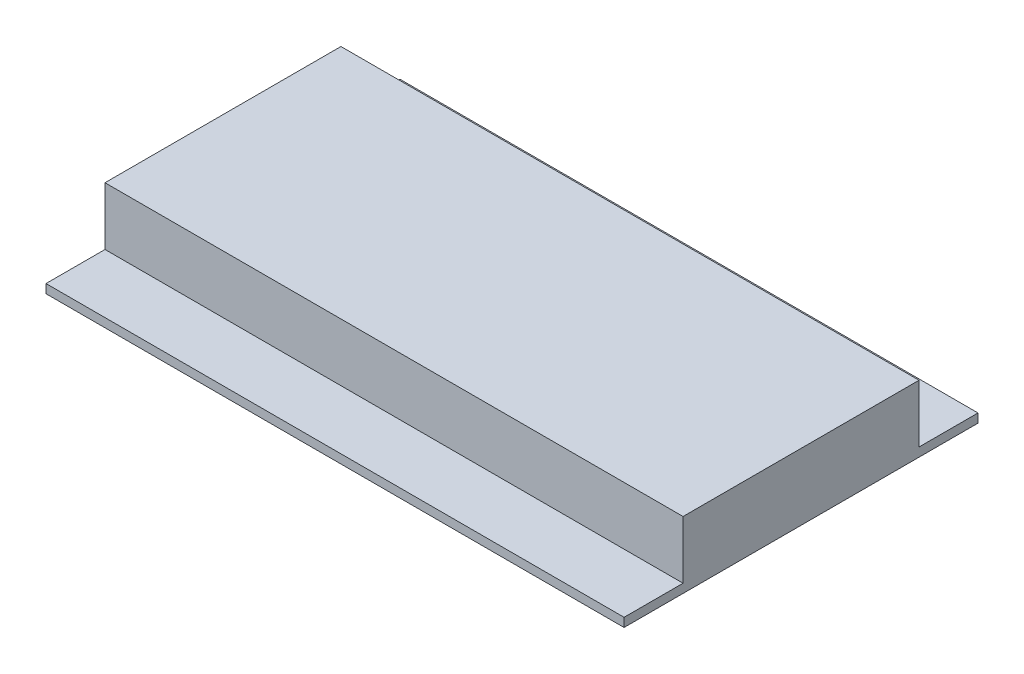
ISO-10303-21;
HEADER;
FILE_DESCRIPTION(('STEP AP214'),'2;1');
FILE_NAME('part.step','',(''),(''),'','','');
FILE_SCHEMA(('AUTOMOTIVE_DESIGN { 1 0 10303 214 1 1 1 1 }'));
ENDSEC;
DATA;
#1=APPLICATION_CONTEXT('core data for automotive mechanical design processes');
#2=APPLICATION_PROTOCOL_DEFINITION('international standard','automotive_design',2000,#1);
#3=PRODUCT_CONTEXT('',#1,'mechanical');
#4=PRODUCT('Part','Part','',(#3));
#5=PRODUCT_RELATED_PRODUCT_CATEGORY('part','',(#4));
#6=PRODUCT_DEFINITION_FORMATION('','',#4);
#7=PRODUCT_DEFINITION_CONTEXT('part definition',#1,'design');
#8=PRODUCT_DEFINITION('design','',#6,#7);
#9=PRODUCT_DEFINITION_SHAPE('','',#8);
#10=(LENGTH_UNIT() NAMED_UNIT(*) SI_UNIT(.MILLI.,.METRE.));
#11=(NAMED_UNIT(*) PLANE_ANGLE_UNIT() SI_UNIT($,.RADIAN.));
#12=(NAMED_UNIT(*) SI_UNIT($,.STERADIAN.) SOLID_ANGLE_UNIT());
#13=UNCERTAINTY_MEASURE_WITH_UNIT(LENGTH_MEASURE(1.E-05),#10,'distance_accuracy_value','');
#14=(GEOMETRIC_REPRESENTATION_CONTEXT(3) GLOBAL_UNCERTAINTY_ASSIGNED_CONTEXT((#13)) GLOBAL_UNIT_ASSIGNED_CONTEXT((#10,
#11,#12)) REPRESENTATION_CONTEXT('',''));
#15=CARTESIAN_POINT('',(0.,0.,0.));
#16=DIRECTION('',(0.,0.,1.));
#17=DIRECTION('',(1.,0.,0.));
#18=AXIS2_PLACEMENT_3D('',#15,#16,#17);
#19=CARTESIAN_POINT('',(0.,1.5,0.));
#20=DIRECTION('',(0.,1.,0.));
#21=DIRECTION('',(0.,0.,1.));
#22=AXIS2_PLACEMENT_3D('',#19,#20,#21);
#23=PLANE('',#22);
#24=DIRECTION('',(-1.,0.,0.));
#25=VECTOR('',#24,1.);
#26=CARTESIAN_POINT('',(-49.,1.5,-20.));
#27=LINE('',#26,#25);
#28=CARTESIAN_POINT('',(49.,1.5,-20.));
#29=VERTEX_POINT('',#28);
#30=CARTESIAN_POINT('',(-49.,1.5,-20.));
#31=VERTEX_POINT('',#30);
#32=EDGE_CURVE('E65',#29,#31,#27,.T.);
#33=ORIENTED_EDGE('',*,*,#32,.F.);
#34=DIRECTION('',(0.,0.,-1.));
#35=VECTOR('',#34,1.);
#36=CARTESIAN_POINT('',(49.,1.5,-30.));
#37=LINE('',#36,#35);
#38=CARTESIAN_POINT('',(49.,1.5,-30.));
#39=VERTEX_POINT('',#38);
#40=EDGE_CURVE('E157',#29,#39,#37,.T.);
#41=ORIENTED_EDGE('',*,*,#40,.T.);
#42=DIRECTION('',(-1.,0.,0.));
#43=VECTOR('',#42,1.);
#44=CARTESIAN_POINT('',(-49.,1.5,-30.));
#45=LINE('',#44,#43);
#46=CARTESIAN_POINT('',(-49.,1.5,-30.));
#47=VERTEX_POINT('',#46);
#48=EDGE_CURVE('E161',#39,#47,#45,.T.);
#49=ORIENTED_EDGE('',*,*,#48,.T.);
#50=DIRECTION('',(0.,0.,1.));
#51=VECTOR('',#50,1.);
#52=CARTESIAN_POINT('',(-49.,1.5,-30.));
#53=LINE('',#52,#51);
#54=EDGE_CURVE('E151',#47,#31,#53,.T.);
#55=ORIENTED_EDGE('',*,*,#54,.T.);
#56=EDGE_LOOP('',(#33,#41,#49,#55));
#57=FACE_BOUND('',#56,.T.);
#58=ADVANCED_FACE('F49',(#57),#23,.T.);
#59=CARTESIAN_POINT('',(-49.,1.5,-30.));
#60=DIRECTION('',(1.,0.,0.));
#61=DIRECTION('',(0.,0.,-1.));
#62=AXIS2_PLACEMENT_3D('',#59,#60,#61);
#63=PLANE('',#62);
#64=DIRECTION('',(0.,0.,1.));
#65=VECTOR('',#64,1.);
#66=CARTESIAN_POINT('',(-49.,0.,-30.));
#67=LINE('',#66,#65);
#68=CARTESIAN_POINT('',(-49.,0.,-30.));
#69=VERTEX_POINT('',#68);
#70=CARTESIAN_POINT('',(-49.,0.,30.));
#71=VERTEX_POINT('',#70);
#72=EDGE_CURVE('E141',#69,#71,#67,.T.);
#73=ORIENTED_EDGE('',*,*,#72,.T.);
#74=DIRECTION('',(0.,-1.,0.));
#75=VECTOR('',#74,1.);
#76=CARTESIAN_POINT('',(-49.,1.5,30.));
#77=LINE('',#76,#75);
#78=CARTESIAN_POINT('',(-49.,1.5,30.));
#79=VERTEX_POINT('',#78);
#80=EDGE_CURVE('E11',#79,#71,#77,.T.);
#81=ORIENTED_EDGE('',*,*,#80,.F.);
#82=CARTESIAN_POINT('',(-49.,1.5,20.));
#83=VERTEX_POINT('',#82);
#84=EDGE_CURVE('E139',#83,#79,#53,.T.);
#85=ORIENTED_EDGE('',*,*,#84,.F.);
#86=DIRECTION('',(0.,-1.,0.));
#87=VECTOR('',#86,1.);
#88=CARTESIAN_POINT('',(-49.,11.3,20.));
#89=LINE('',#88,#87);
#90=CARTESIAN_POINT('',(-49.,11.3,20.));
#91=VERTEX_POINT('',#90);
#92=EDGE_CURVE('E119',#91,#83,#89,.T.);
#93=ORIENTED_EDGE('',*,*,#92,.F.);
#94=DIRECTION('',(0.,0.,1.));
#95=VECTOR('',#94,1.);
#96=CARTESIAN_POINT('',(-49.,11.3,-20.));
#97=LINE('',#96,#95);
#98=CARTESIAN_POINT('',(-49.,11.3,-20.));
#99=VERTEX_POINT('',#98);
#100=EDGE_CURVE('E126',#99,#91,#97,.T.);
#101=ORIENTED_EDGE('',*,*,#100,.F.);
#102=DIRECTION('',(0.,-1.,0.));
#103=VECTOR('',#102,1.);
#104=CARTESIAN_POINT('',(-49.,11.3,-20.));
#105=LINE('',#104,#103);
#106=EDGE_CURVE('E198',#99,#31,#105,.T.);
#107=ORIENTED_EDGE('',*,*,#106,.T.);
#108=ORIENTED_EDGE('',*,*,#54,.F.);
#109=DIRECTION('',(0.,-1.,0.));
#110=VECTOR('',#109,1.);
#111=CARTESIAN_POINT('',(-49.,1.5,-30.));
#112=LINE('',#111,#110);
#113=EDGE_CURVE('E163',#47,#69,#112,.T.);
#114=ORIENTED_EDGE('',*,*,#113,.T.);
#115=EDGE_LOOP('',(#73,#81,#85,#93,#101,#107,#108,#114));
#116=FACE_BOUND('',#115,.T.);
#117=ADVANCED_FACE('F51',(#116),#63,.F.);
#118=CARTESIAN_POINT('',(-49.,1.5,30.));
#119=DIRECTION('',(0.,0.,-1.));
#120=DIRECTION('',(-1.,0.,0.));
#121=AXIS2_PLACEMENT_3D('',#118,#119,#120);
#122=PLANE('',#121);
#123=DIRECTION('',(1.,0.,0.));
#124=VECTOR('',#123,1.);
#125=CARTESIAN_POINT('',(-49.,0.,30.));
#126=LINE('',#125,#124);
#127=CARTESIAN_POINT('',(49.,0.,30.));
#128=VERTEX_POINT('',#127);
#129=EDGE_CURVE('E145',#71,#128,#126,.T.);
#130=ORIENTED_EDGE('',*,*,#129,.T.);
#131=DIRECTION('',(0.,-1.,0.));
#132=VECTOR('',#131,1.);
#133=CARTESIAN_POINT('',(49.,1.5,30.));
#134=LINE('',#133,#132);
#135=CARTESIAN_POINT('',(49.,1.5,30.));
#136=VERTEX_POINT('',#135);
#137=EDGE_CURVE('E58',#136,#128,#134,.T.);
#138=ORIENTED_EDGE('',*,*,#137,.F.);
#139=DIRECTION('',(1.,0.,0.));
#140=VECTOR('',#139,1.);
#141=CARTESIAN_POINT('',(-49.,1.5,30.));
#142=LINE('',#141,#140);
#143=EDGE_CURVE('E154',#79,#136,#142,.T.);
#144=ORIENTED_EDGE('',*,*,#143,.F.);
#145=ORIENTED_EDGE('',*,*,#80,.T.);
#146=EDGE_LOOP('',(#130,#138,#144,#145));
#147=FACE_BOUND('',#146,.T.);
#148=ADVANCED_FACE('F217',(#147),#122,.F.);
#149=CARTESIAN_POINT('',(49.,1.5,-30.));
#150=DIRECTION('',(-1.,0.,0.));
#151=DIRECTION('',(0.,0.,1.));
#152=AXIS2_PLACEMENT_3D('',#149,#150,#151);
#153=PLANE('',#152);
#154=DIRECTION('',(0.,0.,-1.));
#155=VECTOR('',#154,1.);
#156=CARTESIAN_POINT('',(49.,0.,-30.));
#157=LINE('',#156,#155);
#158=CARTESIAN_POINT('',(49.,0.,-30.));
#159=VERTEX_POINT('',#158);
#160=EDGE_CURVE('E167',#128,#159,#157,.T.);
#161=ORIENTED_EDGE('',*,*,#160,.T.);
#162=DIRECTION('',(0.,-1.,0.));
#163=VECTOR('',#162,1.);
#164=CARTESIAN_POINT('',(49.,1.5,-30.));
#165=LINE('',#164,#163);
#166=EDGE_CURVE('E176',#39,#159,#165,.T.);
#167=ORIENTED_EDGE('',*,*,#166,.F.);
#168=ORIENTED_EDGE('',*,*,#40,.F.);
#169=DIRECTION('',(0.,-1.,0.));
#170=VECTOR('',#169,1.);
#171=CARTESIAN_POINT('',(49.,11.3,-20.));
#172=LINE('',#171,#170);
#173=CARTESIAN_POINT('',(49.,11.3,-20.));
#174=VERTEX_POINT('',#173);
#175=EDGE_CURVE('E147',#174,#29,#172,.T.);
#176=ORIENTED_EDGE('',*,*,#175,.F.);
#177=DIRECTION('',(0.,0.,-1.));
#178=VECTOR('',#177,1.);
#179=CARTESIAN_POINT('',(49.,11.3,-20.));
#180=LINE('',#179,#178);
#181=CARTESIAN_POINT('',(49.,11.3,20.));
#182=VERTEX_POINT('',#181);
#183=EDGE_CURVE('E125',#182,#174,#180,.T.);
#184=ORIENTED_EDGE('',*,*,#183,.F.);
#185=DIRECTION('',(0.,-1.,0.));
#186=VECTOR('',#185,1.);
#187=CARTESIAN_POINT('',(49.,11.3,20.));
#188=LINE('',#187,#186);
#189=CARTESIAN_POINT('',(49.,1.5,20.));
#190=VERTEX_POINT('',#189);
#191=EDGE_CURVE('E121',#182,#190,#188,.T.);
#192=ORIENTED_EDGE('',*,*,#191,.T.);
#193=EDGE_CURVE('E158',#136,#190,#37,.T.);
#194=ORIENTED_EDGE('',*,*,#193,.F.);
#195=ORIENTED_EDGE('',*,*,#137,.T.);
#196=EDGE_LOOP('',(#161,#167,#168,#176,#184,#192,#194,#195));
#197=FACE_BOUND('',#196,.T.);
#198=ADVANCED_FACE('F185',(#197),#153,.F.);
#199=CARTESIAN_POINT('',(-49.,1.5,-30.));
#200=DIRECTION('',(0.,0.,1.));
#201=DIRECTION('',(1.,0.,0.));
#202=AXIS2_PLACEMENT_3D('',#199,#200,#201);
#203=PLANE('',#202);
#204=DIRECTION('',(-1.,0.,0.));
#205=VECTOR('',#204,1.);
#206=CARTESIAN_POINT('',(-49.,0.,-30.));
#207=LINE('',#206,#205);
#208=EDGE_CURVE('E170',#159,#69,#207,.T.);
#209=ORIENTED_EDGE('',*,*,#208,.T.);
#210=ORIENTED_EDGE('',*,*,#113,.F.);
#211=ORIENTED_EDGE('',*,*,#48,.F.);
#212=ORIENTED_EDGE('',*,*,#166,.T.);
#213=EDGE_LOOP('',(#209,#210,#211,#212));
#214=FACE_BOUND('',#213,.T.);
#215=ADVANCED_FACE('F195',(#214),#203,.F.);
#216=DIRECTION('',(1.,0.,0.));
#217=VECTOR('',#216,1.);
#218=CARTESIAN_POINT('',(-49.,1.5,20.));
#219=LINE('',#218,#217);
#220=EDGE_CURVE('E73',#83,#190,#219,.T.);
#221=ORIENTED_EDGE('',*,*,#220,.F.);
#222=ORIENTED_EDGE('',*,*,#84,.T.);
#223=ORIENTED_EDGE('',*,*,#143,.T.);
#224=ORIENTED_EDGE('',*,*,#193,.T.);
#225=EDGE_LOOP('',(#221,#222,#223,#224));
#226=FACE_BOUND('',#225,.T.);
#227=ADVANCED_FACE('F216',(#226),#23,.T.);
#228=CARTESIAN_POINT('',(0.,0.,0.));
#229=DIRECTION('',(0.,1.,0.));
#230=DIRECTION('',(0.,0.,1.));
#231=AXIS2_PLACEMENT_3D('',#228,#229,#230);
#232=PLANE('',#231);
#233=ORIENTED_EDGE('',*,*,#72,.F.);
#234=ORIENTED_EDGE('',*,*,#208,.F.);
#235=ORIENTED_EDGE('',*,*,#160,.F.);
#236=ORIENTED_EDGE('',*,*,#129,.F.);
#237=EDGE_LOOP('',(#233,#234,#235,#236));
#238=FACE_BOUND('',#237,.T.);
#239=ADVANCED_FACE('F192',(#238),#232,.F.);
#240=CARTESIAN_POINT('',(-49.,11.3,20.));
#241=DIRECTION('',(0.,0.,-1.));
#242=DIRECTION('',(-1.,0.,0.));
#243=AXIS2_PLACEMENT_3D('',#240,#241,#242);
#244=PLANE('',#243);
#245=ORIENTED_EDGE('',*,*,#220,.T.);
#246=ORIENTED_EDGE('',*,*,#191,.F.);
#247=DIRECTION('',(1.,0.,0.));
#248=VECTOR('',#247,1.);
#249=CARTESIAN_POINT('',(-49.,11.3,20.));
#250=LINE('',#249,#248);
#251=EDGE_CURVE('E115',#91,#182,#250,.T.);
#252=ORIENTED_EDGE('',*,*,#251,.F.);
#253=ORIENTED_EDGE('',*,*,#92,.T.);
#254=EDGE_LOOP('',(#245,#246,#252,#253));
#255=FACE_BOUND('',#254,.T.);
#256=ADVANCED_FACE('F117',(#255),#244,.F.);
#257=CARTESIAN_POINT('',(-49.,11.3,-20.));
#258=DIRECTION('',(0.,0.,1.));
#259=DIRECTION('',(1.,0.,0.));
#260=AXIS2_PLACEMENT_3D('',#257,#258,#259);
#261=PLANE('',#260);
#262=ORIENTED_EDGE('',*,*,#32,.T.);
#263=ORIENTED_EDGE('',*,*,#106,.F.);
#264=DIRECTION('',(-1.,0.,0.));
#265=VECTOR('',#264,1.);
#266=CARTESIAN_POINT('',(-49.,11.3,-20.));
#267=LINE('',#266,#265);
#268=EDGE_CURVE('E131',#174,#99,#267,.T.);
#269=ORIENTED_EDGE('',*,*,#268,.F.);
#270=ORIENTED_EDGE('',*,*,#175,.T.);
#271=EDGE_LOOP('',(#262,#263,#269,#270));
#272=FACE_BOUND('',#271,.T.);
#273=ADVANCED_FACE('F201',(#272),#261,.F.);
#274=CARTESIAN_POINT('',(0.,11.3,0.));
#275=DIRECTION('',(0.,1.,0.));
#276=DIRECTION('',(0.,0.,1.));
#277=AXIS2_PLACEMENT_3D('',#274,#275,#276);
#278=PLANE('',#277);
#279=ORIENTED_EDGE('',*,*,#100,.T.);
#280=ORIENTED_EDGE('',*,*,#251,.T.);
#281=ORIENTED_EDGE('',*,*,#183,.T.);
#282=ORIENTED_EDGE('',*,*,#268,.T.);
#283=EDGE_LOOP('',(#279,#280,#281,#282));
#284=FACE_BOUND('',#283,.T.);
#285=ADVANCED_FACE('F129',(#284),#278,.T.);
#286=CLOSED_SHELL('',(#58,#117,#148,#198,#215,#227,#239,#256,#273,#285));
#287=MANIFOLD_SOLID_BREP('B2',#286);
#288=ADVANCED_BREP_SHAPE_REPRESENTATION('',(#18,#287),#14);
#289=SHAPE_DEFINITION_REPRESENTATION(#9,#288);
ENDSEC;
END-ISO-10303-21;
